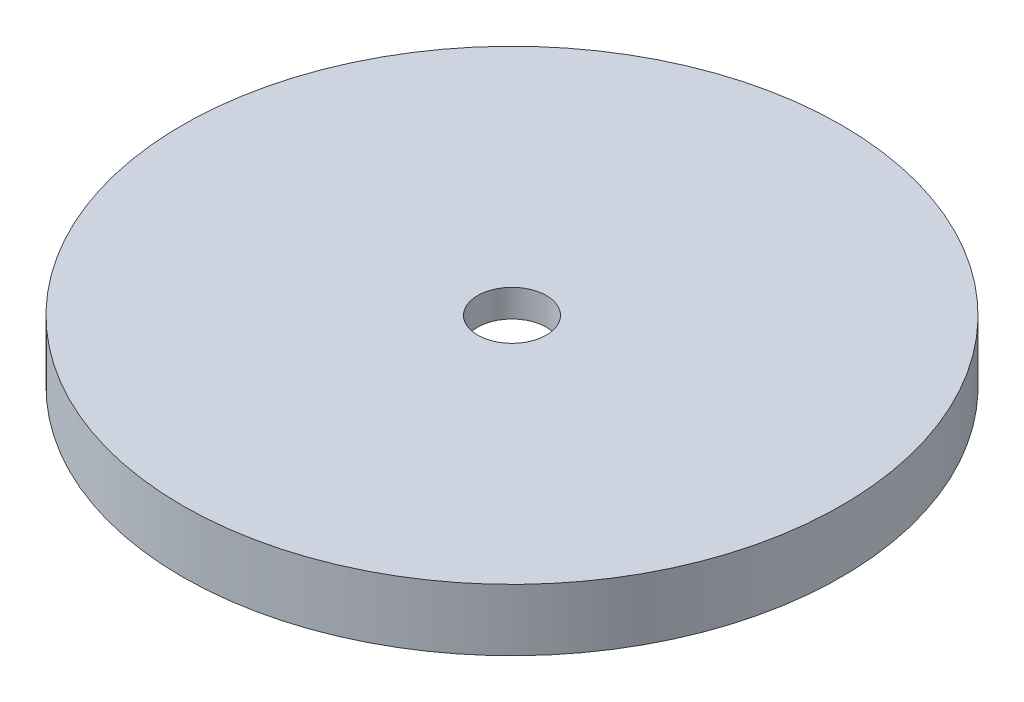
ISO-10303-21;
HEADER;
FILE_DESCRIPTION(('STEP AP214'),'2;1');
FILE_NAME('part.step','',(''),(''),'','','');
FILE_SCHEMA(('AUTOMOTIVE_DESIGN { 1 0 10303 214 1 1 1 1 }'));
ENDSEC;
DATA;
#1=APPLICATION_CONTEXT('core data for automotive mechanical design processes');
#2=APPLICATION_PROTOCOL_DEFINITION('international standard','automotive_design',2000,#1);
#3=PRODUCT_CONTEXT('',#1,'mechanical');
#4=PRODUCT('Part','Part','',(#3));
#5=PRODUCT_RELATED_PRODUCT_CATEGORY('part','',(#4));
#6=PRODUCT_DEFINITION_FORMATION('','',#4);
#7=PRODUCT_DEFINITION_CONTEXT('part definition',#1,'design');
#8=PRODUCT_DEFINITION('design','',#6,#7);
#9=PRODUCT_DEFINITION_SHAPE('','',#8);
#10=(LENGTH_UNIT() NAMED_UNIT(*) SI_UNIT(.MILLI.,.METRE.));
#11=(NAMED_UNIT(*) PLANE_ANGLE_UNIT() SI_UNIT($,.RADIAN.));
#12=(NAMED_UNIT(*) SI_UNIT($,.STERADIAN.) SOLID_ANGLE_UNIT());
#13=UNCERTAINTY_MEASURE_WITH_UNIT(LENGTH_MEASURE(1.E-05),#10,'distance_accuracy_value','');
#14=(GEOMETRIC_REPRESENTATION_CONTEXT(3) GLOBAL_UNCERTAINTY_ASSIGNED_CONTEXT((#13)) GLOBAL_UNIT_ASSIGNED_CONTEXT((#10,
#11,#12)) REPRESENTATION_CONTEXT('',''));
#15=CARTESIAN_POINT('',(0.,0.,0.));
#16=DIRECTION('',(0.,0.,1.));
#17=DIRECTION('',(1.,0.,0.));
#18=AXIS2_PLACEMENT_3D('',#15,#16,#17);
#19=CARTESIAN_POINT('',(0.,0.,0.));
#20=DIRECTION('',(0.,1.,0.));
#21=DIRECTION('',(0.,0.,1.));
#22=AXIS2_PLACEMENT_3D('',#19,#20,#21);
#23=PLANE('',#22);
#24=CARTESIAN_POINT('',(0.,0.,0.));
#25=DIRECTION('',(0.,1.,0.));
#26=DIRECTION('',(0.,0.,1.));
#27=AXIS2_PLACEMENT_3D('',#24,#25,#26);
#28=CIRCLE('',#27,24.);
#29=CARTESIAN_POINT('',(0.,0.,24.));
#30=VERTEX_POINT('',#29);
#31=EDGE_CURVE('E10',#30,#30,#28,.T.);
#32=ORIENTED_EDGE('',*,*,#31,.F.);
#33=EDGE_LOOP('',(#32));
#34=FACE_BOUND('',#33,.T.);
#35=CARTESIAN_POINT('',(0.,0.,0.));
#36=DIRECTION('',(0.,1.,0.));
#37=DIRECTION('',(0.,0.,1.));
#38=AXIS2_PLACEMENT_3D('',#35,#36,#37);
#39=CIRCLE('',#38,19.);
#40=CARTESIAN_POINT('',(0.,0.,19.));
#41=VERTEX_POINT('',#40);
#42=EDGE_CURVE('E44',#41,#41,#39,.T.);
#43=ORIENTED_EDGE('',*,*,#42,.T.);
#44=EDGE_LOOP('',(#43));
#45=FACE_BOUND('',#44,.T.);
#46=ADVANCED_FACE('F37',(#34,#45),#23,.F.);
#47=CARTESIAN_POINT('',(0.,2.5,0.));
#48=DIRECTION('',(0.,-1.,0.));
#49=DIRECTION('',(0.,0.,-1.));
#50=AXIS2_PLACEMENT_3D('',#47,#48,#49);
#51=CYLINDRICAL_SURFACE('',#50,24.);
#52=ORIENTED_EDGE('',*,*,#31,.T.);
#53=EDGE_LOOP('',(#52));
#54=FACE_BOUND('',#53,.T.);
#55=CARTESIAN_POINT('',(0.,4.5,0.));
#56=DIRECTION('',(0.,1.,0.));
#57=DIRECTION('',(0.,0.,1.));
#58=AXIS2_PLACEMENT_3D('',#55,#56,#57);
#59=CIRCLE('',#58,24.);
#60=CARTESIAN_POINT('',(0.,4.5,24.));
#61=VERTEX_POINT('',#60);
#62=EDGE_CURVE('E52',#61,#61,#59,.T.);
#63=ORIENTED_EDGE('',*,*,#62,.F.);
#64=EDGE_LOOP('',(#63));
#65=FACE_BOUND('',#64,.T.);
#66=ADVANCED_FACE('F39',(#54,#65),#51,.T.);
#67=CARTESIAN_POINT('',(0.,2.5,0.));
#68=DIRECTION('',(0.,-1.,0.));
#69=DIRECTION('',(0.,0.,-1.));
#70=AXIS2_PLACEMENT_3D('',#67,#68,#69);
#71=CYLINDRICAL_SURFACE('',#70,19.);
#72=CARTESIAN_POINT('',(0.,2.5,0.));
#73=DIRECTION('',(0.,1.,0.));
#74=DIRECTION('',(0.,0.,1.));
#75=AXIS2_PLACEMENT_3D('',#72,#73,#74);
#76=CIRCLE('',#75,19.);
#77=CARTESIAN_POINT('',(0.,2.5,19.));
#78=VERTEX_POINT('',#77);
#79=EDGE_CURVE('E48',#78,#78,#76,.T.);
#80=ORIENTED_EDGE('',*,*,#79,.T.);
#81=EDGE_LOOP('',(#80));
#82=FACE_BOUND('',#81,.T.);
#83=ORIENTED_EDGE('',*,*,#42,.F.);
#84=EDGE_LOOP('',(#83));
#85=FACE_BOUND('',#84,.T.);
#86=ADVANCED_FACE('F76',(#82,#85),#71,.F.);
#87=CARTESIAN_POINT('',(0.,2.5,0.));
#88=DIRECTION('',(0.,1.,0.));
#89=DIRECTION('',(0.,0.,1.));
#90=AXIS2_PLACEMENT_3D('',#87,#88,#89);
#91=PLANE('',#90);
#92=CARTESIAN_POINT('',(0.,2.5,0.));
#93=DIRECTION('',(0.,1.,0.));
#94=DIRECTION('',(0.,0.,1.));
#95=AXIS2_PLACEMENT_3D('',#92,#93,#94);
#96=CIRCLE('',#95,2.5);
#97=CARTESIAN_POINT('',(0.,2.5,2.5));
#98=VERTEX_POINT('',#97);
#99=EDGE_CURVE('E57',#98,#98,#96,.T.);
#100=ORIENTED_EDGE('',*,*,#99,.T.);
#101=EDGE_LOOP('',(#100));
#102=FACE_BOUND('',#101,.T.);
#103=ORIENTED_EDGE('',*,*,#79,.F.);
#104=EDGE_LOOP('',(#103));
#105=FACE_BOUND('',#104,.T.);
#106=ADVANCED_FACE('F73',(#102,#105),#91,.F.);
#107=CARTESIAN_POINT('',(0.,4.5,0.));
#108=DIRECTION('',(0.,1.,0.));
#109=DIRECTION('',(0.,0.,1.));
#110=AXIS2_PLACEMENT_3D('',#107,#108,#109);
#111=PLANE('',#110);
#112=CARTESIAN_POINT('',(0.,4.5,0.));
#113=DIRECTION('',(0.,-1.,0.));
#114=DIRECTION('',(0.,0.,-1.));
#115=AXIS2_PLACEMENT_3D('',#112,#113,#114);
#116=CIRCLE('',#115,2.5);
#117=CARTESIAN_POINT('',(0.,4.5,-2.5));
#118=VERTEX_POINT('',#117);
#119=EDGE_CURVE('E60',#118,#118,#116,.T.);
#120=ORIENTED_EDGE('',*,*,#119,.T.);
#121=EDGE_LOOP('',(#120));
#122=FACE_BOUND('',#121,.T.);
#123=ORIENTED_EDGE('',*,*,#62,.T.);
#124=EDGE_LOOP('',(#123));
#125=FACE_BOUND('',#124,.T.);
#126=ADVANCED_FACE('F64',(#122,#125),#111,.T.);
#127=CARTESIAN_POINT('',(0.,4.5,0.));
#128=DIRECTION('',(0.,-1.,0.));
#129=DIRECTION('',(0.,0.,-1.));
#130=AXIS2_PLACEMENT_3D('',#127,#128,#129);
#131=CYLINDRICAL_SURFACE('',#130,2.5);
#132=ORIENTED_EDGE('',*,*,#119,.F.);
#133=EDGE_LOOP('',(#132));
#134=FACE_BOUND('',#133,.T.);
#135=ORIENTED_EDGE('',*,*,#99,.F.);
#136=EDGE_LOOP('',(#135));
#137=FACE_BOUND('',#136,.T.);
#138=ADVANCED_FACE('F67',(#134,#137),#131,.F.);
#139=CLOSED_SHELL('',(#46,#66,#86,#106,#126,#138));
#140=MANIFOLD_SOLID_BREP('B2',#139);
#141=ADVANCED_BREP_SHAPE_REPRESENTATION('',(#18,#140),#14);
#142=SHAPE_DEFINITION_REPRESENTATION(#9,#141);
ENDSEC;
END-ISO-10303-21;
